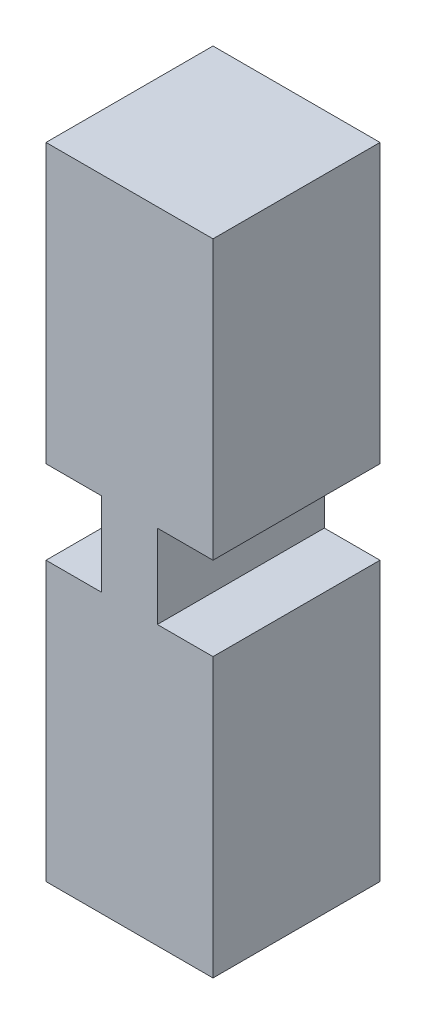
ISO-10303-21;
HEADER;
FILE_DESCRIPTION(('STEP AP214'),'2;1');
FILE_NAME('part.step','',(''),(''),'','','');
FILE_SCHEMA(('AUTOMOTIVE_DESIGN { 1 0 10303 214 1 1 1 1 }'));
ENDSEC;
DATA;
#1=APPLICATION_CONTEXT('core data for automotive mechanical design processes');
#2=APPLICATION_PROTOCOL_DEFINITION('international standard','automotive_design',2000,#1);
#3=PRODUCT_CONTEXT('',#1,'mechanical');
#4=PRODUCT('Part','Part','',(#3));
#5=PRODUCT_RELATED_PRODUCT_CATEGORY('part','',(#4));
#6=PRODUCT_DEFINITION_FORMATION('','',#4);
#7=PRODUCT_DEFINITION_CONTEXT('part definition',#1,'design');
#8=PRODUCT_DEFINITION('design','',#6,#7);
#9=PRODUCT_DEFINITION_SHAPE('','',#8);
#10=(LENGTH_UNIT() NAMED_UNIT(*) SI_UNIT(.MILLI.,.METRE.));
#11=(NAMED_UNIT(*) PLANE_ANGLE_UNIT() SI_UNIT($,.RADIAN.));
#12=(NAMED_UNIT(*) SI_UNIT($,.STERADIAN.) SOLID_ANGLE_UNIT());
#13=UNCERTAINTY_MEASURE_WITH_UNIT(LENGTH_MEASURE(1.E-05),#10,'distance_accuracy_value','');
#14=(GEOMETRIC_REPRESENTATION_CONTEXT(3) GLOBAL_UNCERTAINTY_ASSIGNED_CONTEXT((#13)) GLOBAL_UNIT_ASSIGNED_CONTEXT((#10,
#11,#12)) REPRESENTATION_CONTEXT('',''));
#15=CARTESIAN_POINT('',(0.,0.,0.));
#16=DIRECTION('',(0.,0.,1.));
#17=DIRECTION('',(1.,0.,0.));
#18=AXIS2_PLACEMENT_3D('',#15,#16,#17);
#19=CARTESIAN_POINT('',(-10.,-15.,30.));
#20=DIRECTION('',(1.,0.,0.));
#21=DIRECTION('',(0.,0.,-1.));
#22=AXIS2_PLACEMENT_3D('',#19,#20,#21);
#23=PLANE('',#22);
#24=DIRECTION('',(0.,-1.,0.));
#25=VECTOR('',#24,1.);
#26=CARTESIAN_POINT('',(-10.,-15.,-30.));
#27=LINE('',#26,#25);
#28=CARTESIAN_POINT('',(-10.,15.,-30.));
#29=VERTEX_POINT('',#28);
#30=CARTESIAN_POINT('',(-10.,-15.,-30.));
#31=VERTEX_POINT('',#30);
#32=EDGE_CURVE('E56',#29,#31,#27,.T.);
#33=ORIENTED_EDGE('',*,*,#32,.T.);
#34=DIRECTION('',(0.,0.,-1.));
#35=VECTOR('',#34,1.);
#36=CARTESIAN_POINT('',(-10.,-15.,30.));
#37=LINE('',#36,#35);
#38=CARTESIAN_POINT('',(-10.,-15.,30.));
#39=VERTEX_POINT('',#38);
#40=EDGE_CURVE('E224',#39,#31,#37,.T.);
#41=ORIENTED_EDGE('',*,*,#40,.F.);
#42=DIRECTION('',(0.,-1.,0.));
#43=VECTOR('',#42,1.);
#44=CARTESIAN_POINT('',(-10.,-15.,30.));
#45=LINE('',#44,#43);
#46=CARTESIAN_POINT('',(-10.,15.,30.));
#47=VERTEX_POINT('',#46);
#48=EDGE_CURVE('E210',#47,#39,#45,.T.);
#49=ORIENTED_EDGE('',*,*,#48,.F.);
#50=DIRECTION('',(0.,0.,-1.));
#51=VECTOR('',#50,1.);
#52=CARTESIAN_POINT('',(-10.,15.,30.));
#53=LINE('',#52,#51);
#54=EDGE_CURVE('E215',#47,#29,#53,.T.);
#55=ORIENTED_EDGE('',*,*,#54,.T.);
#56=EDGE_LOOP('',(#33,#41,#49,#55));
#57=FACE_BOUND('',#56,.T.);
#58=DIRECTION('',(0.,1.,0.));
#59=VECTOR('',#58,1.);
#60=CARTESIAN_POINT('',(-10.,-13.4,28.4));
#61=LINE('',#60,#59);
#62=CARTESIAN_POINT('',(-10.,-13.4,28.4));
#63=VERTEX_POINT('',#62);
#64=CARTESIAN_POINT('',(-10.,-10.4,28.4));
#65=VERTEX_POINT('',#64);
#66=EDGE_CURVE('E158',#63,#65,#61,.T.);
#67=ORIENTED_EDGE('',*,*,#66,.F.);
#68=DIRECTION('',(0.,0.,-1.));
#69=VECTOR('',#68,1.);
#70=CARTESIAN_POINT('',(-10.,-13.4,28.4));
#71=LINE('',#70,#69);
#72=CARTESIAN_POINT('',(-10.,-13.4,-28.4));
#73=VERTEX_POINT('',#72);
#74=EDGE_CURVE('E155',#63,#73,#71,.T.);
#75=ORIENTED_EDGE('',*,*,#74,.T.);
#76=DIRECTION('',(0.,1.,0.));
#77=VECTOR('',#76,1.);
#78=CARTESIAN_POINT('',(-10.,-13.4,-28.4));
#79=LINE('',#78,#77);
#80=CARTESIAN_POINT('',(-10.,-10.4,-28.4));
#81=VERTEX_POINT('',#80);
#82=EDGE_CURVE('E456',#73,#81,#79,.T.);
#83=ORIENTED_EDGE('',*,*,#82,.T.);
#84=DIRECTION('',(0.,0.,-1.));
#85=VECTOR('',#84,1.);
#86=CARTESIAN_POINT('',(-10.,-10.4,28.4));
#87=LINE('',#86,#85);
#88=EDGE_CURVE('E176',#65,#81,#87,.T.);
#89=ORIENTED_EDGE('',*,*,#88,.F.);
#90=EDGE_LOOP('',(#67,#75,#83,#89));
#91=FACE_BOUND('',#90,.T.);
#92=ADVANCED_FACE('F33',(#57,#91),#23,.F.);
#93=CARTESIAN_POINT('',(-30.,-15.,30.));
#94=DIRECTION('',(0.,-1.,0.));
#95=DIRECTION('',(0.,0.,-1.));
#96=AXIS2_PLACEMENT_3D('',#93,#94,#95);
#97=PLANE('',#96);
#98=DIRECTION('',(0.,0.,-1.));
#99=VECTOR('',#98,1.);
#100=CARTESIAN_POINT('',(10.,-15.,30.));
#101=LINE('',#100,#99);
#102=CARTESIAN_POINT('',(10.,-15.,30.));
#103=VERTEX_POINT('',#102);
#104=CARTESIAN_POINT('',(10.,-15.,-30.));
#105=VERTEX_POINT('',#104);
#106=EDGE_CURVE('E222',#103,#105,#101,.T.);
#107=ORIENTED_EDGE('',*,*,#106,.F.);
#108=DIRECTION('',(-1.,0.,0.));
#109=VECTOR('',#108,1.);
#110=CARTESIAN_POINT('',(-30.,-15.,30.));
#111=LINE('',#110,#109);
#112=CARTESIAN_POINT('',(30.,-15.,30.));
#113=VERTEX_POINT('',#112);
#114=EDGE_CURVE('E236',#113,#103,#111,.T.);
#115=ORIENTED_EDGE('',*,*,#114,.F.);
#116=DIRECTION('',(0.,0.,-1.));
#117=VECTOR('',#116,1.);
#118=CARTESIAN_POINT('',(30.,-15.,30.));
#119=LINE('',#118,#117);
#120=CARTESIAN_POINT('',(30.,-15.,-30.));
#121=VERTEX_POINT('',#120);
#122=EDGE_CURVE('E251',#113,#121,#119,.T.);
#123=ORIENTED_EDGE('',*,*,#122,.T.);
#124=DIRECTION('',(-1.,0.,0.));
#125=VECTOR('',#124,1.);
#126=CARTESIAN_POINT('',(-30.,-15.,-30.));
#127=LINE('',#126,#125);
#128=EDGE_CURVE('E231',#121,#105,#127,.T.);
#129=ORIENTED_EDGE('',*,*,#128,.T.);
#130=EDGE_LOOP('',(#107,#115,#123,#129));
#131=FACE_BOUND('',#130,.T.);
#132=ADVANCED_FACE('F269',(#131),#97,.F.);
#133=CARTESIAN_POINT('',(-30.,-115.,30.));
#134=DIRECTION('',(1.,0.,0.));
#135=DIRECTION('',(0.,0.,-1.));
#136=AXIS2_PLACEMENT_3D('',#133,#134,#135);
#137=PLANE('',#136);
#138=DIRECTION('',(0.,-1.,0.));
#139=VECTOR('',#138,1.);
#140=CARTESIAN_POINT('',(-30.,-115.,-30.));
#141=LINE('',#140,#139);
#142=CARTESIAN_POINT('',(-30.,-15.,-30.));
#143=VERTEX_POINT('',#142);
#144=CARTESIAN_POINT('',(-30.,-115.,-30.));
#145=VERTEX_POINT('',#144);
#146=EDGE_CURVE('E226',#143,#145,#141,.T.);
#147=ORIENTED_EDGE('',*,*,#146,.T.);
#148=DIRECTION('',(0.,0.,-1.));
#149=VECTOR('',#148,1.);
#150=CARTESIAN_POINT('',(-30.,-115.,30.));
#151=LINE('',#150,#149);
#152=CARTESIAN_POINT('',(-30.,-115.,30.));
#153=VERTEX_POINT('',#152);
#154=EDGE_CURVE('E11',#153,#145,#151,.T.);
#155=ORIENTED_EDGE('',*,*,#154,.F.);
#156=DIRECTION('',(0.,-1.,0.));
#157=VECTOR('',#156,1.);
#158=CARTESIAN_POINT('',(-30.,-115.,30.));
#159=LINE('',#158,#157);
#160=CARTESIAN_POINT('',(-30.,-15.,30.));
#161=VERTEX_POINT('',#160);
#162=EDGE_CURVE('E227',#161,#153,#159,.T.);
#163=ORIENTED_EDGE('',*,*,#162,.F.);
#164=DIRECTION('',(0.,0.,-1.));
#165=VECTOR('',#164,1.);
#166=CARTESIAN_POINT('',(-30.,-15.,30.));
#167=LINE('',#166,#165);
#168=EDGE_CURVE('E239',#161,#143,#167,.T.);
#169=ORIENTED_EDGE('',*,*,#168,.T.);
#170=EDGE_LOOP('',(#147,#155,#163,#169));
#171=FACE_BOUND('',#170,.T.);
#172=ADVANCED_FACE('F35',(#171),#137,.F.);
#173=CARTESIAN_POINT('',(-30.,-115.,30.));
#174=DIRECTION('',(0.,1.,0.));
#175=DIRECTION('',(0.,0.,1.));
#176=AXIS2_PLACEMENT_3D('',#173,#174,#175);
#177=PLANE('',#176);
#178=DIRECTION('',(1.,0.,0.));
#179=VECTOR('',#178,1.);
#180=CARTESIAN_POINT('',(-30.,-115.,-30.));
#181=LINE('',#180,#179);
#182=CARTESIAN_POINT('',(30.,-115.,-30.));
#183=VERTEX_POINT('',#182);
#184=EDGE_CURVE('E242',#145,#183,#181,.T.);
#185=ORIENTED_EDGE('',*,*,#184,.T.);
#186=DIRECTION('',(0.,0.,-1.));
#187=VECTOR('',#186,1.);
#188=CARTESIAN_POINT('',(30.,-115.,30.));
#189=LINE('',#188,#187);
#190=CARTESIAN_POINT('',(30.,-115.,30.));
#191=VERTEX_POINT('',#190);
#192=EDGE_CURVE('E41',#191,#183,#189,.T.);
#193=ORIENTED_EDGE('',*,*,#192,.F.);
#194=DIRECTION('',(1.,0.,0.));
#195=VECTOR('',#194,1.);
#196=CARTESIAN_POINT('',(-30.,-115.,30.));
#197=LINE('',#196,#195);
#198=EDGE_CURVE('E230',#153,#191,#197,.T.);
#199=ORIENTED_EDGE('',*,*,#198,.F.);
#200=ORIENTED_EDGE('',*,*,#154,.T.);
#201=EDGE_LOOP('',(#185,#193,#199,#200));
#202=FACE_BOUND('',#201,.T.);
#203=ADVANCED_FACE('F276',(#202),#177,.F.);
#204=CARTESIAN_POINT('',(30.,-115.,30.));
#205=DIRECTION('',(-1.,0.,0.));
#206=DIRECTION('',(0.,0.,1.));
#207=AXIS2_PLACEMENT_3D('',#204,#205,#206);
#208=PLANE('',#207);
#209=DIRECTION('',(0.,1.,0.));
#210=VECTOR('',#209,1.);
#211=CARTESIAN_POINT('',(30.,-115.,-30.));
#212=LINE('',#211,#210);
#213=EDGE_CURVE('E244',#183,#121,#212,.T.);
#214=ORIENTED_EDGE('',*,*,#213,.T.);
#215=ORIENTED_EDGE('',*,*,#122,.F.);
#216=DIRECTION('',(0.,1.,0.));
#217=VECTOR('',#216,1.);
#218=CARTESIAN_POINT('',(30.,-115.,30.));
#219=LINE('',#218,#217);
#220=EDGE_CURVE('E233',#191,#113,#219,.T.);
#221=ORIENTED_EDGE('',*,*,#220,.F.);
#222=ORIENTED_EDGE('',*,*,#192,.T.);
#223=EDGE_LOOP('',(#214,#215,#221,#222));
#224=FACE_BOUND('',#223,.T.);
#225=ADVANCED_FACE('F258',(#224),#208,.F.);
#226=EDGE_CURVE('E235',#39,#161,#111,.T.);
#227=ORIENTED_EDGE('',*,*,#226,.F.);
#228=ORIENTED_EDGE('',*,*,#40,.T.);
#229=EDGE_CURVE('E246',#31,#143,#127,.T.);
#230=ORIENTED_EDGE('',*,*,#229,.T.);
#231=ORIENTED_EDGE('',*,*,#168,.F.);
#232=EDGE_LOOP('',(#227,#228,#230,#231));
#233=FACE_BOUND('',#232,.T.);
#234=ADVANCED_FACE('F282',(#233),#97,.F.);
#235=CARTESIAN_POINT('',(0.,0.,30.));
#236=DIRECTION('',(0.,0.,-1.));
#237=DIRECTION('',(-1.,0.,0.));
#238=AXIS2_PLACEMENT_3D('',#235,#236,#237);
#239=PLANE('',#238);
#240=ORIENTED_EDGE('',*,*,#162,.T.);
#241=ORIENTED_EDGE('',*,*,#198,.T.);
#242=ORIENTED_EDGE('',*,*,#220,.T.);
#243=ORIENTED_EDGE('',*,*,#114,.T.);
#244=DIRECTION('',(0.,1.,0.));
#245=VECTOR('',#244,1.);
#246=CARTESIAN_POINT('',(10.,-15.,30.));
#247=LINE('',#246,#245);
#248=CARTESIAN_POINT('',(10.,15.,30.));
#249=VERTEX_POINT('',#248);
#250=EDGE_CURVE('E212',#103,#249,#247,.T.);
#251=ORIENTED_EDGE('',*,*,#250,.T.);
#252=DIRECTION('',(1.,0.,0.));
#253=VECTOR('',#252,1.);
#254=CARTESIAN_POINT('',(-30.,15.,30.));
#255=LINE('',#254,#253);
#256=CARTESIAN_POINT('',(30.,15.,30.));
#257=VERTEX_POINT('',#256);
#258=EDGE_CURVE('E183',#249,#257,#255,.T.);
#259=ORIENTED_EDGE('',*,*,#258,.T.);
#260=DIRECTION('',(0.,1.,0.));
#261=VECTOR('',#260,1.);
#262=CARTESIAN_POINT('',(30.,15.,30.));
#263=LINE('',#262,#261);
#264=CARTESIAN_POINT('',(30.,115.,30.));
#265=VERTEX_POINT('',#264);
#266=EDGE_CURVE('E188',#257,#265,#263,.T.);
#267=ORIENTED_EDGE('',*,*,#266,.T.);
#268=DIRECTION('',(-1.,0.,0.));
#269=VECTOR('',#268,1.);
#270=CARTESIAN_POINT('',(-30.,115.,30.));
#271=LINE('',#270,#269);
#272=CARTESIAN_POINT('',(-30.,115.,30.));
#273=VERTEX_POINT('',#272);
#274=EDGE_CURVE('E190',#265,#273,#271,.T.);
#275=ORIENTED_EDGE('',*,*,#274,.T.);
#276=DIRECTION('',(0.,-1.,0.));
#277=VECTOR('',#276,1.);
#278=CARTESIAN_POINT('',(-30.,15.,30.));
#279=LINE('',#278,#277);
#280=CARTESIAN_POINT('',(-30.,15.,30.));
#281=VERTEX_POINT('',#280);
#282=EDGE_CURVE('E180',#273,#281,#279,.T.);
#283=ORIENTED_EDGE('',*,*,#282,.T.);
#284=EDGE_CURVE('E185',#281,#47,#255,.T.);
#285=ORIENTED_EDGE('',*,*,#284,.T.);
#286=ORIENTED_EDGE('',*,*,#48,.T.);
#287=ORIENTED_EDGE('',*,*,#226,.T.);
#288=EDGE_LOOP('',(#240,#241,#242,#243,#251,#259,#267,#275,#283,#285,#286,#287));
#289=FACE_BOUND('',#288,.T.);
#290=ADVANCED_FACE('F272',(#289),#239,.F.);
#291=CARTESIAN_POINT('',(0.,0.,-30.));
#292=DIRECTION('',(0.,0.,-1.));
#293=DIRECTION('',(-1.,0.,0.));
#294=AXIS2_PLACEMENT_3D('',#291,#292,#293);
#295=PLANE('',#294);
#296=ORIENTED_EDGE('',*,*,#146,.F.);
#297=ORIENTED_EDGE('',*,*,#229,.F.);
#298=ORIENTED_EDGE('',*,*,#32,.F.);
#299=DIRECTION('',(1.,0.,0.));
#300=VECTOR('',#299,1.);
#301=CARTESIAN_POINT('',(-30.,15.,-30.));
#302=LINE('',#301,#300);
#303=CARTESIAN_POINT('',(-30.,15.,-30.));
#304=VERTEX_POINT('',#303);
#305=EDGE_CURVE('E193',#304,#29,#302,.T.);
#306=ORIENTED_EDGE('',*,*,#305,.F.);
#307=DIRECTION('',(0.,-1.,0.));
#308=VECTOR('',#307,1.);
#309=CARTESIAN_POINT('',(-30.,15.,-30.));
#310=LINE('',#309,#308);
#311=CARTESIAN_POINT('',(-30.,115.,-30.));
#312=VERTEX_POINT('',#311);
#313=EDGE_CURVE('E171',#312,#304,#310,.T.);
#314=ORIENTED_EDGE('',*,*,#313,.F.);
#315=DIRECTION('',(-1.,0.,0.));
#316=VECTOR('',#315,1.);
#317=CARTESIAN_POINT('',(-30.,115.,-30.));
#318=LINE('',#317,#316);
#319=CARTESIAN_POINT('',(30.,115.,-30.));
#320=VERTEX_POINT('',#319);
#321=EDGE_CURVE('E184',#320,#312,#318,.T.);
#322=ORIENTED_EDGE('',*,*,#321,.F.);
#323=DIRECTION('',(0.,1.,0.));
#324=VECTOR('',#323,1.);
#325=CARTESIAN_POINT('',(30.,15.,-30.));
#326=LINE('',#325,#324);
#327=CARTESIAN_POINT('',(30.,15.,-30.));
#328=VERTEX_POINT('',#327);
#329=EDGE_CURVE('E196',#328,#320,#326,.T.);
#330=ORIENTED_EDGE('',*,*,#329,.F.);
#331=CARTESIAN_POINT('',(10.,15.,-30.));
#332=VERTEX_POINT('',#331);
#333=EDGE_CURVE('E174',#332,#328,#302,.T.);
#334=ORIENTED_EDGE('',*,*,#333,.F.);
#335=DIRECTION('',(0.,1.,0.));
#336=VECTOR('',#335,1.);
#337=CARTESIAN_POINT('',(10.,-15.,-30.));
#338=LINE('',#337,#336);
#339=EDGE_CURVE('E213',#105,#332,#338,.T.);
#340=ORIENTED_EDGE('',*,*,#339,.F.);
#341=ORIENTED_EDGE('',*,*,#128,.F.);
#342=ORIENTED_EDGE('',*,*,#213,.F.);
#343=ORIENTED_EDGE('',*,*,#184,.F.);
#344=EDGE_LOOP('',(#296,#297,#298,#306,#314,#322,#330,#334,#340,#341,#342,#343));
#345=FACE_BOUND('',#344,.T.);
#346=ADVANCED_FACE('F264',(#345),#295,.T.);
#347=CARTESIAN_POINT('',(10.,-15.,30.));
#348=DIRECTION('',(-1.,0.,0.));
#349=DIRECTION('',(0.,0.,1.));
#350=AXIS2_PLACEMENT_3D('',#347,#348,#349);
#351=PLANE('',#350);
#352=ORIENTED_EDGE('',*,*,#339,.T.);
#353=DIRECTION('',(0.,0.,-1.));
#354=VECTOR('',#353,1.);
#355=CARTESIAN_POINT('',(10.,15.,30.));
#356=LINE('',#355,#354);
#357=EDGE_CURVE('E219',#249,#332,#356,.T.);
#358=ORIENTED_EDGE('',*,*,#357,.F.);
#359=ORIENTED_EDGE('',*,*,#250,.F.);
#360=ORIENTED_EDGE('',*,*,#106,.T.);
#361=EDGE_LOOP('',(#352,#358,#359,#360));
#362=FACE_BOUND('',#361,.T.);
#363=ADVANCED_FACE('F307',(#362),#351,.F.);
#364=CARTESIAN_POINT('',(-30.,15.,30.));
#365=DIRECTION('',(0.,1.,0.));
#366=DIRECTION('',(0.,0.,1.));
#367=AXIS2_PLACEMENT_3D('',#364,#365,#366);
#368=PLANE('',#367);
#369=ORIENTED_EDGE('',*,*,#258,.F.);
#370=ORIENTED_EDGE('',*,*,#357,.T.);
#371=ORIENTED_EDGE('',*,*,#333,.T.);
#372=DIRECTION('',(0.,0.,-1.));
#373=VECTOR('',#372,1.);
#374=CARTESIAN_POINT('',(30.,15.,30.));
#375=LINE('',#374,#373);
#376=EDGE_CURVE('E204',#257,#328,#375,.T.);
#377=ORIENTED_EDGE('',*,*,#376,.F.);
#378=EDGE_LOOP('',(#369,#370,#371,#377));
#379=FACE_BOUND('',#378,.T.);
#380=ADVANCED_FACE('F305',(#379),#368,.F.);
#381=CARTESIAN_POINT('',(-30.,15.,30.));
#382=DIRECTION('',(1.,0.,0.));
#383=DIRECTION('',(0.,0.,-1.));
#384=AXIS2_PLACEMENT_3D('',#381,#382,#383);
#385=PLANE('',#384);
#386=ORIENTED_EDGE('',*,*,#313,.T.);
#387=DIRECTION('',(0.,0.,-1.));
#388=VECTOR('',#387,1.);
#389=CARTESIAN_POINT('',(-30.,15.,30.));
#390=LINE('',#389,#388);
#391=EDGE_CURVE('E207',#281,#304,#390,.T.);
#392=ORIENTED_EDGE('',*,*,#391,.F.);
#393=ORIENTED_EDGE('',*,*,#282,.F.);
#394=DIRECTION('',(0.,0.,-1.));
#395=VECTOR('',#394,1.);
#396=CARTESIAN_POINT('',(-30.,115.,30.));
#397=LINE('',#396,#395);
#398=EDGE_CURVE('E191',#273,#312,#397,.T.);
#399=ORIENTED_EDGE('',*,*,#398,.T.);
#400=EDGE_LOOP('',(#386,#392,#393,#399));
#401=FACE_BOUND('',#400,.T.);
#402=ADVANCED_FACE('F292',(#401),#385,.F.);
#403=ORIENTED_EDGE('',*,*,#54,.F.);
#404=ORIENTED_EDGE('',*,*,#284,.F.);
#405=ORIENTED_EDGE('',*,*,#391,.T.);
#406=ORIENTED_EDGE('',*,*,#305,.T.);
#407=EDGE_LOOP('',(#403,#404,#405,#406));
#408=FACE_BOUND('',#407,.T.);
#409=ADVANCED_FACE('F286',(#408),#368,.F.);
#410=CARTESIAN_POINT('',(30.,15.,30.));
#411=DIRECTION('',(-1.,0.,0.));
#412=DIRECTION('',(0.,0.,1.));
#413=AXIS2_PLACEMENT_3D('',#410,#411,#412);
#414=PLANE('',#413);
#415=ORIENTED_EDGE('',*,*,#329,.T.);
#416=DIRECTION('',(0.,0.,-1.));
#417=VECTOR('',#416,1.);
#418=CARTESIAN_POINT('',(30.,115.,30.));
#419=LINE('',#418,#417);
#420=EDGE_CURVE('E201',#265,#320,#419,.T.);
#421=ORIENTED_EDGE('',*,*,#420,.F.);
#422=ORIENTED_EDGE('',*,*,#266,.F.);
#423=ORIENTED_EDGE('',*,*,#376,.T.);
#424=EDGE_LOOP('',(#415,#421,#422,#423));
#425=FACE_BOUND('',#424,.T.);
#426=ADVANCED_FACE('F301',(#425),#414,.F.);
#427=CARTESIAN_POINT('',(-30.,115.,30.));
#428=DIRECTION('',(0.,-1.,0.));
#429=DIRECTION('',(0.,0.,-1.));
#430=AXIS2_PLACEMENT_3D('',#427,#428,#429);
#431=PLANE('',#430);
#432=ORIENTED_EDGE('',*,*,#321,.T.);
#433=ORIENTED_EDGE('',*,*,#398,.F.);
#434=ORIENTED_EDGE('',*,*,#274,.F.);
#435=ORIENTED_EDGE('',*,*,#420,.T.);
#436=EDGE_LOOP('',(#432,#433,#434,#435));
#437=FACE_BOUND('',#436,.T.);
#438=ADVANCED_FACE('F297',(#437),#431,.F.);
#439=CARTESIAN_POINT('',(-11.6,-13.4,28.4));
#440=DIRECTION('',(1.,0.,0.));
#441=DIRECTION('',(0.,0.,-1.));
#442=AXIS2_PLACEMENT_3D('',#439,#440,#441);
#443=PLANE('',#442);
#444=DIRECTION('',(0.,-1.,0.));
#445=VECTOR('',#444,1.);
#446=CARTESIAN_POINT('',(-11.6,-13.4,-28.4));
#447=LINE('',#446,#445);
#448=CARTESIAN_POINT('',(-11.6,-10.4,-28.4));
#449=VERTEX_POINT('',#448);
#450=CARTESIAN_POINT('',(-11.6,-13.4,-28.4));
#451=VERTEX_POINT('',#450);
#452=EDGE_CURVE('E170',#449,#451,#447,.T.);
#453=ORIENTED_EDGE('',*,*,#452,.T.);
#454=DIRECTION('',(0.,0.,-1.));
#455=VECTOR('',#454,1.);
#456=CARTESIAN_POINT('',(-11.6,-13.4,28.4));
#457=LINE('',#456,#455);
#458=CARTESIAN_POINT('',(-11.6,-13.4,28.4));
#459=VERTEX_POINT('',#458);
#460=EDGE_CURVE('E152',#459,#451,#457,.T.);
#461=ORIENTED_EDGE('',*,*,#460,.F.);
#462=DIRECTION('',(0.,-1.,0.));
#463=VECTOR('',#462,1.);
#464=CARTESIAN_POINT('',(-11.6,-13.4,28.4));
#465=LINE('',#464,#463);
#466=CARTESIAN_POINT('',(-11.6,-10.4,28.4));
#467=VERTEX_POINT('',#466);
#468=EDGE_CURVE('E159',#467,#459,#465,.T.);
#469=ORIENTED_EDGE('',*,*,#468,.F.);
#470=DIRECTION('',(0.,0.,-1.));
#471=VECTOR('',#470,1.);
#472=CARTESIAN_POINT('',(-11.6,-10.4,28.4));
#473=LINE('',#472,#471);
#474=EDGE_CURVE('E464',#467,#449,#473,.T.);
#475=ORIENTED_EDGE('',*,*,#474,.T.);
#476=EDGE_LOOP('',(#453,#461,#469,#475));
#477=FACE_BOUND('',#476,.T.);
#478=ADVANCED_FACE('F169',(#477),#443,.F.);
#479=CARTESIAN_POINT('',(-11.6,-13.4,28.4));
#480=DIRECTION('',(0.,1.,0.));
#481=DIRECTION('',(0.,0.,1.));
#482=AXIS2_PLACEMENT_3D('',#479,#480,#481);
#483=PLANE('',#482);
#484=DIRECTION('',(1.,0.,0.));
#485=VECTOR('',#484,1.);
#486=CARTESIAN_POINT('',(-11.6,-13.4,-28.4));
#487=LINE('',#486,#485);
#488=EDGE_CURVE('E454',#451,#73,#487,.T.);
#489=ORIENTED_EDGE('',*,*,#488,.T.);
#490=ORIENTED_EDGE('',*,*,#74,.F.);
#491=DIRECTION('',(1.,0.,0.));
#492=VECTOR('',#491,1.);
#493=CARTESIAN_POINT('',(-11.6,-13.4,28.4));
#494=LINE('',#493,#492);
#495=EDGE_CURVE('E148',#459,#63,#494,.T.);
#496=ORIENTED_EDGE('',*,*,#495,.F.);
#497=ORIENTED_EDGE('',*,*,#460,.T.);
#498=EDGE_LOOP('',(#489,#490,#496,#497));
#499=FACE_BOUND('',#498,.T.);
#500=ADVANCED_FACE('F150',(#499),#483,.F.);
#501=CARTESIAN_POINT('',(-11.6,-10.4,28.4));
#502=DIRECTION('',(0.,-1.,0.));
#503=DIRECTION('',(0.,0.,-1.));
#504=AXIS2_PLACEMENT_3D('',#501,#502,#503);
#505=PLANE('',#504);
#506=DIRECTION('',(-1.,0.,0.));
#507=VECTOR('',#506,1.);
#508=CARTESIAN_POINT('',(-11.6,-10.4,-28.4));
#509=LINE('',#508,#507);
#510=EDGE_CURVE('E48',#81,#449,#509,.T.);
#511=ORIENTED_EDGE('',*,*,#510,.T.);
#512=ORIENTED_EDGE('',*,*,#474,.F.);
#513=DIRECTION('',(-1.,0.,0.));
#514=VECTOR('',#513,1.);
#515=CARTESIAN_POINT('',(-11.6,-10.4,28.4));
#516=LINE('',#515,#514);
#517=EDGE_CURVE('E164',#65,#467,#516,.T.);
#518=ORIENTED_EDGE('',*,*,#517,.F.);
#519=ORIENTED_EDGE('',*,*,#88,.T.);
#520=EDGE_LOOP('',(#511,#512,#518,#519));
#521=FACE_BOUND('',#520,.T.);
#522=ADVANCED_FACE('F424',(#521),#505,.F.);
#523=CARTESIAN_POINT('',(0.,0.,28.4));
#524=DIRECTION('',(0.,0.,-1.));
#525=DIRECTION('',(-1.,0.,0.));
#526=AXIS2_PLACEMENT_3D('',#523,#524,#525);
#527=PLANE('',#526);
#528=ORIENTED_EDGE('',*,*,#468,.T.);
#529=ORIENTED_EDGE('',*,*,#495,.T.);
#530=ORIENTED_EDGE('',*,*,#66,.T.);
#531=ORIENTED_EDGE('',*,*,#517,.T.);
#532=EDGE_LOOP('',(#528,#529,#530,#531));
#533=FACE_BOUND('',#532,.T.);
#534=ADVANCED_FACE('F162',(#533),#527,.F.);
#535=CARTESIAN_POINT('',(0.,0.,-28.4));
#536=DIRECTION('',(0.,0.,-1.));
#537=DIRECTION('',(-1.,0.,0.));
#538=AXIS2_PLACEMENT_3D('',#535,#536,#537);
#539=PLANE('',#538);
#540=ORIENTED_EDGE('',*,*,#452,.F.);
#541=ORIENTED_EDGE('',*,*,#510,.F.);
#542=ORIENTED_EDGE('',*,*,#82,.F.);
#543=ORIENTED_EDGE('',*,*,#488,.F.);
#544=EDGE_LOOP('',(#540,#541,#542,#543));
#545=FACE_BOUND('',#544,.T.);
#546=ADVANCED_FACE('F442',(#545),#539,.T.);
#547=CLOSED_SHELL('',(#92,#132,#172,#203,#225,#234,#290,#346,#363,#380,#402,#409,#426,#438,#478,
#500,#522,#534,#546));
#548=MANIFOLD_SOLID_BREP('B2',#547);
#549=ADVANCED_BREP_SHAPE_REPRESENTATION('',(#18,#548),#14);
#550=SHAPE_DEFINITION_REPRESENTATION(#9,#549);
ENDSEC;
END-ISO-10303-21;
